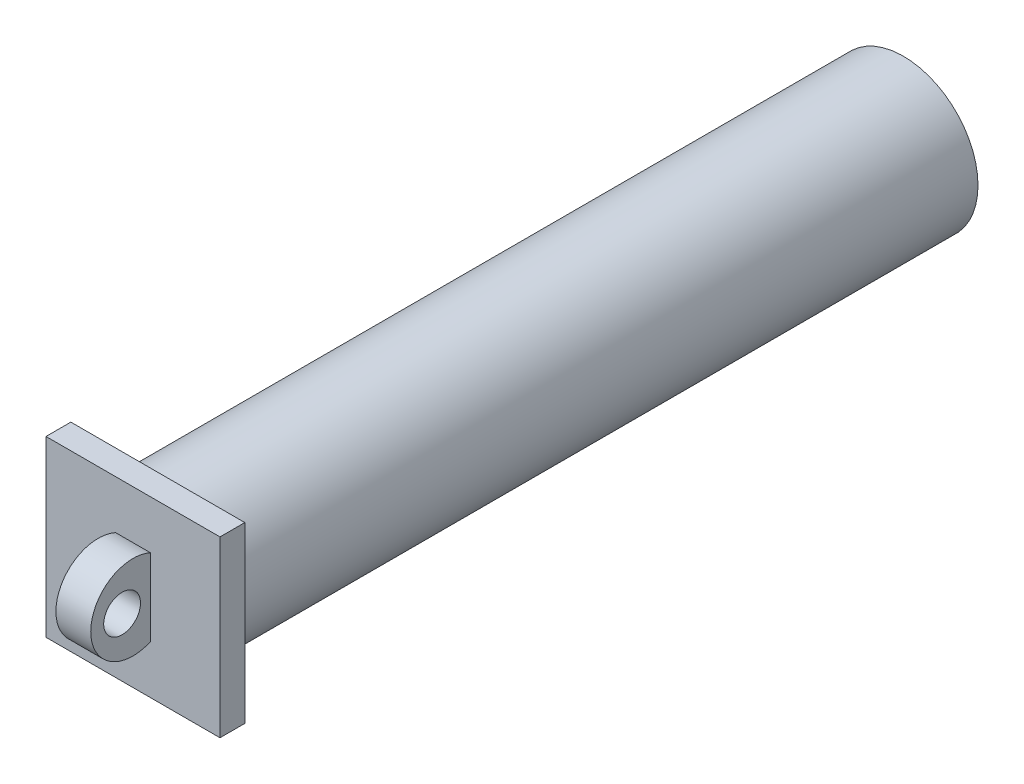
ISO-10303-21;
HEADER;
FILE_DESCRIPTION(('STEP AP214'),'2;1');
FILE_NAME('part.step','',(''),(''),'','','');
FILE_SCHEMA(('AUTOMOTIVE_DESIGN { 1 0 10303 214 1 1 1 1 }'));
ENDSEC;
DATA;
#1=APPLICATION_CONTEXT('core data for automotive mechanical design processes');
#2=APPLICATION_PROTOCOL_DEFINITION('international standard','automotive_design',2000,#1);
#3=PRODUCT_CONTEXT('',#1,'mechanical');
#4=PRODUCT('Part','Part','',(#3));
#5=PRODUCT_RELATED_PRODUCT_CATEGORY('part','',(#4));
#6=PRODUCT_DEFINITION_FORMATION('','',#4);
#7=PRODUCT_DEFINITION_CONTEXT('part definition',#1,'design');
#8=PRODUCT_DEFINITION('design','',#6,#7);
#9=PRODUCT_DEFINITION_SHAPE('','',#8);
#10=(LENGTH_UNIT() NAMED_UNIT(*) SI_UNIT(.MILLI.,.METRE.));
#11=(NAMED_UNIT(*) PLANE_ANGLE_UNIT() SI_UNIT($,.RADIAN.));
#12=(NAMED_UNIT(*) SI_UNIT($,.STERADIAN.) SOLID_ANGLE_UNIT());
#13=UNCERTAINTY_MEASURE_WITH_UNIT(LENGTH_MEASURE(1.E-05),#10,'distance_accuracy_value','');
#14=(GEOMETRIC_REPRESENTATION_CONTEXT(3) GLOBAL_UNCERTAINTY_ASSIGNED_CONTEXT((#13)) GLOBAL_UNIT_ASSIGNED_CONTEXT((#10,
#11,#12)) REPRESENTATION_CONTEXT('',''));
#15=CARTESIAN_POINT('',(0.,0.,0.));
#16=DIRECTION('',(0.,0.,1.));
#17=DIRECTION('',(1.,0.,0.));
#18=AXIS2_PLACEMENT_3D('',#15,#16,#17);
#19=CARTESIAN_POINT('',(-17.5,-17.5,155.));
#20=DIRECTION('',(1.,0.,0.));
#21=DIRECTION('',(0.,0.,-1.));
#22=AXIS2_PLACEMENT_3D('',#19,#20,#21);
#23=PLANE('',#22);
#24=DIRECTION('',(0.,0.,-1.));
#25=VECTOR('',#24,1.);
#26=CARTESIAN_POINT('',(-17.5,-17.5,155.));
#27=LINE('',#26,#25);
#28=CARTESIAN_POINT('',(-17.5,-17.5,155.));
#29=VERTEX_POINT('',#28);
#30=CARTESIAN_POINT('',(-17.5,-17.5,150.));
#31=VERTEX_POINT('',#30);
#32=EDGE_CURVE('E160',#29,#31,#27,.T.);
#33=ORIENTED_EDGE('',*,*,#32,.F.);
#34=DIRECTION('',(0.,-1.,0.));
#35=VECTOR('',#34,1.);
#36=CARTESIAN_POINT('',(-17.5,-17.5,155.));
#37=LINE('',#36,#35);
#38=CARTESIAN_POINT('',(-17.5,17.5,155.));
#39=VERTEX_POINT('',#38);
#40=EDGE_CURVE('E145',#39,#29,#37,.T.);
#41=ORIENTED_EDGE('',*,*,#40,.F.);
#42=DIRECTION('',(0.,0.,-1.));
#43=VECTOR('',#42,1.);
#44=CARTESIAN_POINT('',(-17.5,17.5,155.));
#45=LINE('',#44,#43);
#46=CARTESIAN_POINT('',(-17.5,17.5,150.));
#47=VERTEX_POINT('',#46);
#48=EDGE_CURVE('E163',#39,#47,#45,.T.);
#49=ORIENTED_EDGE('',*,*,#48,.T.);
#50=DIRECTION('',(0.,-1.,0.));
#51=VECTOR('',#50,1.);
#52=CARTESIAN_POINT('',(-17.5,-17.5,150.));
#53=LINE('',#52,#51);
#54=EDGE_CURVE('E153',#47,#31,#53,.T.);
#55=ORIENTED_EDGE('',*,*,#54,.T.);
#56=EDGE_LOOP('',(#33,#41,#49,#55));
#57=FACE_BOUND('',#56,.T.);
#58=ADVANCED_FACE('F47',(#57),#23,.F.);
#59=CARTESIAN_POINT('',(17.5,0.,158.5));
#60=DIRECTION('',(-1.,0.,0.));
#61=DIRECTION('',(0.,0.,1.));
#62=AXIS2_PLACEMENT_3D('',#59,#60,#61);
#63=CYLINDRICAL_SURFACE('',#62,8.50000000000001);
#64=DIRECTION('',(-1.,0.,0.));
#65=VECTOR('',#64,1.);
#66=CARTESIAN_POINT('',(17.5,7.74596669241484,155.));
#67=LINE('',#66,#65);
#68=CARTESIAN_POINT('',(3.5,7.74596669241484,155.));
#69=VERTEX_POINT('',#68);
#70=CARTESIAN_POINT('',(-3.5,7.74596669241484,155.));
#71=VERTEX_POINT('',#70);
#72=EDGE_CURVE('E115',#69,#71,#67,.T.);
#73=ORIENTED_EDGE('',*,*,#72,.T.);
#74=CARTESIAN_POINT('',(-3.5,0.,158.5));
#75=DIRECTION('',(1.,0.,0.));
#76=DIRECTION('',(0.,0.,-1.));
#77=AXIS2_PLACEMENT_3D('',#74,#75,#76);
#78=CIRCLE('',#77,8.50000000000001);
#79=CARTESIAN_POINT('',(-3.5,-7.74596669241484,155.));
#80=VERTEX_POINT('',#79);
#81=EDGE_CURVE('E121',#71,#80,#78,.T.);
#82=ORIENTED_EDGE('',*,*,#81,.T.);
#83=DIRECTION('',(-1.,0.,0.));
#84=VECTOR('',#83,1.);
#85=CARTESIAN_POINT('',(17.5,-7.74596669241484,155.));
#86=LINE('',#85,#84);
#87=CARTESIAN_POINT('',(3.5,-7.74596669241484,155.));
#88=VERTEX_POINT('',#87);
#89=EDGE_CURVE('E117',#88,#80,#86,.T.);
#90=ORIENTED_EDGE('',*,*,#89,.F.);
#91=CARTESIAN_POINT('',(3.5,0.,158.5));
#92=DIRECTION('',(1.,0.,0.));
#93=DIRECTION('',(0.,0.,-1.));
#94=AXIS2_PLACEMENT_3D('',#91,#92,#93);
#95=CIRCLE('',#94,8.50000000000001);
#96=EDGE_CURVE('E128',#69,#88,#95,.T.);
#97=ORIENTED_EDGE('',*,*,#96,.F.);
#98=EDGE_LOOP('',(#73,#82,#90,#97));
#99=FACE_BOUND('',#98,.T.);
#100=ADVANCED_FACE('F127',(#99),#63,.T.);
#101=CARTESIAN_POINT('',(0.,0.,155.));
#102=DIRECTION('',(0.,0.,-1.));
#103=DIRECTION('',(-1.,0.,0.));
#104=AXIS2_PLACEMENT_3D('',#101,#102,#103);
#105=PLANE('',#104);
#106=DIRECTION('',(0.,-1.,0.));
#107=VECTOR('',#106,1.);
#108=CARTESIAN_POINT('',(-3.5,0.,155.));
#109=LINE('',#108,#107);
#110=EDGE_CURVE('E111',#71,#80,#109,.T.);
#111=ORIENTED_EDGE('',*,*,#110,.F.);
#112=ORIENTED_EDGE('',*,*,#72,.F.);
#113=DIRECTION('',(0.,-1.,0.));
#114=VECTOR('',#113,1.);
#115=CARTESIAN_POINT('',(3.5,0.,155.));
#116=LINE('',#115,#114);
#117=EDGE_CURVE('E64',#69,#88,#116,.T.);
#118=ORIENTED_EDGE('',*,*,#117,.T.);
#119=ORIENTED_EDGE('',*,*,#89,.T.);
#120=EDGE_LOOP('',(#111,#112,#118,#119));
#121=FACE_BOUND('',#120,.T.);
#122=ORIENTED_EDGE('',*,*,#40,.T.);
#123=DIRECTION('',(1.,0.,0.));
#124=VECTOR('',#123,1.);
#125=CARTESIAN_POINT('',(-17.5,-17.5,155.));
#126=LINE('',#125,#124);
#127=CARTESIAN_POINT('',(17.5,-17.5,155.));
#128=VERTEX_POINT('',#127);
#129=EDGE_CURVE('E73',#29,#128,#126,.T.);
#130=ORIENTED_EDGE('',*,*,#129,.T.);
#131=DIRECTION('',(0.,1.,0.));
#132=VECTOR('',#131,1.);
#133=CARTESIAN_POINT('',(17.5,-17.5,155.));
#134=LINE('',#133,#132);
#135=CARTESIAN_POINT('',(17.5,17.5,155.));
#136=VERTEX_POINT('',#135);
#137=EDGE_CURVE('E99',#128,#136,#134,.T.);
#138=ORIENTED_EDGE('',*,*,#137,.T.);
#139=DIRECTION('',(-1.,0.,0.));
#140=VECTOR('',#139,1.);
#141=CARTESIAN_POINT('',(-17.5,17.5,155.));
#142=LINE('',#141,#140);
#143=EDGE_CURVE('E142',#136,#39,#142,.T.);
#144=ORIENTED_EDGE('',*,*,#143,.T.);
#145=EDGE_LOOP('',(#122,#130,#138,#144));
#146=FACE_BOUND('',#145,.T.);
#147=ADVANCED_FACE('F113',(#121,#146),#105,.F.);
#148=CARTESIAN_POINT('',(0.,0.,0.));
#149=DIRECTION('',(0.,0.,1.));
#150=DIRECTION('',(1.,0.,0.));
#151=AXIS2_PLACEMENT_3D('',#148,#149,#150);
#152=PLANE('',#151);
#153=CARTESIAN_POINT('',(0.,0.,0.));
#154=DIRECTION('',(0.,0.,1.));
#155=DIRECTION('',(1.,0.,0.));
#156=AXIS2_PLACEMENT_3D('',#153,#154,#155);
#157=CIRCLE('',#156,15.);
#158=CARTESIAN_POINT('',(15.,0.,0.));
#159=VERTEX_POINT('',#158);
#160=EDGE_CURVE('E57',#159,#159,#157,.T.);
#161=ORIENTED_EDGE('',*,*,#160,.F.);
#162=EDGE_LOOP('',(#161));
#163=FACE_BOUND('',#162,.T.);
#164=CARTESIAN_POINT('',(0.,0.,0.));
#165=DIRECTION('',(0.,0.,1.));
#166=DIRECTION('',(1.,0.,0.));
#167=AXIS2_PLACEMENT_3D('',#164,#165,#166);
#168=CIRCLE('',#167,10.);
#169=CARTESIAN_POINT('',(10.,0.,0.));
#170=VERTEX_POINT('',#169);
#171=EDGE_CURVE('E175',#170,#170,#168,.T.);
#172=ORIENTED_EDGE('',*,*,#171,.T.);
#173=EDGE_LOOP('',(#172));
#174=FACE_BOUND('',#173,.T.);
#175=ADVANCED_FACE('F183',(#163,#174),#152,.F.);
#176=CARTESIAN_POINT('',(0.,0.,150.));
#177=DIRECTION('',(0.,0.,-1.));
#178=DIRECTION('',(-1.,0.,0.));
#179=AXIS2_PLACEMENT_3D('',#176,#177,#178);
#180=CYLINDRICAL_SURFACE('',#179,15.);
#181=CARTESIAN_POINT('',(0.,0.,150.));
#182=DIRECTION('',(0.,0.,1.));
#183=DIRECTION('',(1.,0.,0.));
#184=AXIS2_PLACEMENT_3D('',#181,#182,#183);
#185=CIRCLE('',#184,15.);
#186=CARTESIAN_POINT('',(15.,0.,150.));
#187=VERTEX_POINT('',#186);
#188=EDGE_CURVE('E11',#187,#187,#185,.T.);
#189=ORIENTED_EDGE('',*,*,#188,.F.);
#190=EDGE_LOOP('',(#189));
#191=FACE_BOUND('',#190,.T.);
#192=ORIENTED_EDGE('',*,*,#160,.T.);
#193=EDGE_LOOP('',(#192));
#194=FACE_BOUND('',#193,.T.);
#195=ADVANCED_FACE('F49',(#191,#194),#180,.T.);
#196=CARTESIAN_POINT('',(0.,0.,150.));
#197=DIRECTION('',(0.,0.,-1.));
#198=DIRECTION('',(-1.,0.,0.));
#199=AXIS2_PLACEMENT_3D('',#196,#197,#198);
#200=CYLINDRICAL_SURFACE('',#199,10.);
#201=CARTESIAN_POINT('',(0.,0.,150.));
#202=DIRECTION('',(0.,0.,1.));
#203=DIRECTION('',(1.,0.,0.));
#204=AXIS2_PLACEMENT_3D('',#201,#202,#203);
#205=CIRCLE('',#204,10.);
#206=CARTESIAN_POINT('',(10.,0.,150.));
#207=VERTEX_POINT('',#206);
#208=EDGE_CURVE('E171',#207,#207,#205,.T.);
#209=ORIENTED_EDGE('',*,*,#208,.T.);
#210=EDGE_LOOP('',(#209));
#211=FACE_BOUND('',#210,.T.);
#212=ORIENTED_EDGE('',*,*,#171,.F.);
#213=EDGE_LOOP('',(#212));
#214=FACE_BOUND('',#213,.T.);
#215=ADVANCED_FACE('F188',(#211,#214),#200,.F.);
#216=CARTESIAN_POINT('',(0.,0.,150.));
#217=DIRECTION('',(0.,0.,-1.));
#218=DIRECTION('',(-1.,0.,0.));
#219=AXIS2_PLACEMENT_3D('',#216,#217,#218);
#220=PLANE('',#219);
#221=ORIENTED_EDGE('',*,*,#208,.F.);
#222=EDGE_LOOP('',(#221));
#223=FACE_BOUND('',#222,.T.);
#224=ADVANCED_FACE('F190',(#223),#220,.T.);
#225=CARTESIAN_POINT('',(17.5,-17.5,155.));
#226=DIRECTION('',(-1.,0.,0.));
#227=DIRECTION('',(0.,0.,1.));
#228=AXIS2_PLACEMENT_3D('',#225,#226,#227);
#229=PLANE('',#228);
#230=DIRECTION('',(0.,0.,-1.));
#231=VECTOR('',#230,1.);
#232=CARTESIAN_POINT('',(17.5,17.5,155.));
#233=LINE('',#232,#231);
#234=CARTESIAN_POINT('',(17.5,17.5,150.));
#235=VERTEX_POINT('',#234);
#236=EDGE_CURVE('E167',#136,#235,#233,.T.);
#237=ORIENTED_EDGE('',*,*,#236,.F.);
#238=ORIENTED_EDGE('',*,*,#137,.F.);
#239=DIRECTION('',(0.,0.,-1.));
#240=VECTOR('',#239,1.);
#241=CARTESIAN_POINT('',(17.5,-17.5,155.));
#242=LINE('',#241,#240);
#243=CARTESIAN_POINT('',(17.5,-17.5,150.));
#244=VERTEX_POINT('',#243);
#245=EDGE_CURVE('E149',#128,#244,#242,.T.);
#246=ORIENTED_EDGE('',*,*,#245,.T.);
#247=DIRECTION('',(0.,1.,0.));
#248=VECTOR('',#247,1.);
#249=CARTESIAN_POINT('',(17.5,-17.5,150.));
#250=LINE('',#249,#248);
#251=EDGE_CURVE('E130',#244,#235,#250,.T.);
#252=ORIENTED_EDGE('',*,*,#251,.T.);
#253=EDGE_LOOP('',(#237,#238,#246,#252));
#254=FACE_BOUND('',#253,.T.);
#255=ADVANCED_FACE('F197',(#254),#229,.F.);
#256=CARTESIAN_POINT('',(-17.5,17.5,155.));
#257=DIRECTION('',(0.,-1.,0.));
#258=DIRECTION('',(0.,0.,-1.));
#259=AXIS2_PLACEMENT_3D('',#256,#257,#258);
#260=PLANE('',#259);
#261=DIRECTION('',(-1.,0.,0.));
#262=VECTOR('',#261,1.);
#263=CARTESIAN_POINT('',(-17.5,17.5,150.));
#264=LINE('',#263,#262);
#265=EDGE_CURVE('E135',#235,#47,#264,.T.);
#266=ORIENTED_EDGE('',*,*,#265,.T.);
#267=ORIENTED_EDGE('',*,*,#48,.F.);
#268=ORIENTED_EDGE('',*,*,#143,.F.);
#269=ORIENTED_EDGE('',*,*,#236,.T.);
#270=EDGE_LOOP('',(#266,#267,#268,#269));
#271=FACE_BOUND('',#270,.T.);
#272=ADVANCED_FACE('F215',(#271),#260,.F.);
#273=CARTESIAN_POINT('',(-17.5,-17.5,155.));
#274=DIRECTION('',(0.,1.,0.));
#275=DIRECTION('',(0.,0.,1.));
#276=AXIS2_PLACEMENT_3D('',#273,#274,#275);
#277=PLANE('',#276);
#278=DIRECTION('',(1.,0.,0.));
#279=VECTOR('',#278,1.);
#280=CARTESIAN_POINT('',(-17.5,-17.5,150.));
#281=LINE('',#280,#279);
#282=EDGE_CURVE('E94',#31,#244,#281,.T.);
#283=ORIENTED_EDGE('',*,*,#282,.T.);
#284=ORIENTED_EDGE('',*,*,#245,.F.);
#285=ORIENTED_EDGE('',*,*,#129,.F.);
#286=ORIENTED_EDGE('',*,*,#32,.T.);
#287=EDGE_LOOP('',(#283,#284,#285,#286));
#288=FACE_BOUND('',#287,.T.);
#289=ADVANCED_FACE('F214',(#288),#277,.F.);
#290=ORIENTED_EDGE('',*,*,#188,.T.);
#291=EDGE_LOOP('',(#290));
#292=FACE_BOUND('',#291,.T.);
#293=ORIENTED_EDGE('',*,*,#251,.F.);
#294=ORIENTED_EDGE('',*,*,#282,.F.);
#295=ORIENTED_EDGE('',*,*,#54,.F.);
#296=ORIENTED_EDGE('',*,*,#265,.F.);
#297=EDGE_LOOP('',(#293,#294,#295,#296));
#298=FACE_BOUND('',#297,.T.);
#299=ADVANCED_FACE('F200',(#292,#298),#220,.T.);
#300=CARTESIAN_POINT('',(3.5,0.,0.));
#301=DIRECTION('',(1.,0.,0.));
#302=DIRECTION('',(0.,0.,-1.));
#303=AXIS2_PLACEMENT_3D('',#300,#301,#302);
#304=PLANE('',#303);
#305=CARTESIAN_POINT('',(3.5,0.,160.690072365424));
#306=DIRECTION('',(1.,0.,0.));
#307=DIRECTION('',(0.,0.,-1.));
#308=AXIS2_PLACEMENT_3D('',#305,#306,#307);
#309=CIRCLE('',#308,3.70021090057086);
#310=CARTESIAN_POINT('',(3.5,0.,156.989861464854));
#311=VERTEX_POINT('',#310);
#312=EDGE_CURVE('E250',#311,#311,#309,.T.);
#313=ORIENTED_EDGE('',*,*,#312,.F.);
#314=EDGE_LOOP('',(#313));
#315=FACE_BOUND('',#314,.T.);
#316=ORIENTED_EDGE('',*,*,#117,.F.);
#317=ORIENTED_EDGE('',*,*,#96,.T.);
#318=EDGE_LOOP('',(#316,#317));
#319=FACE_BOUND('',#318,.T.);
#320=ADVANCED_FACE('F228',(#315,#319),#304,.T.);
#321=CARTESIAN_POINT('',(-3.5,0.,0.));
#322=DIRECTION('',(1.,0.,0.));
#323=DIRECTION('',(0.,0.,-1.));
#324=AXIS2_PLACEMENT_3D('',#321,#322,#323);
#325=PLANE('',#324);
#326=CARTESIAN_POINT('',(-3.5,0.,160.690072365424));
#327=DIRECTION('',(1.,0.,0.));
#328=DIRECTION('',(0.,0.,-1.));
#329=AXIS2_PLACEMENT_3D('',#326,#327,#328);
#330=CIRCLE('',#329,3.70021090057086);
#331=CARTESIAN_POINT('',(-3.5,0.,156.989861464854));
#332=VERTEX_POINT('',#331);
#333=EDGE_CURVE('E51',#332,#332,#330,.T.);
#334=ORIENTED_EDGE('',*,*,#333,.T.);
#335=EDGE_LOOP('',(#334));
#336=FACE_BOUND('',#335,.T.);
#337=ORIENTED_EDGE('',*,*,#110,.T.);
#338=ORIENTED_EDGE('',*,*,#81,.F.);
#339=EDGE_LOOP('',(#337,#338));
#340=FACE_BOUND('',#339,.T.);
#341=ADVANCED_FACE('F123',(#336,#340),#325,.F.);
#342=CARTESIAN_POINT('',(-17.5,0.,160.690072365424));
#343=DIRECTION('',(1.,0.,0.));
#344=DIRECTION('',(0.,0.,-1.));
#345=AXIS2_PLACEMENT_3D('',#342,#343,#344);
#346=CYLINDRICAL_SURFACE('',#345,3.70021090057086);
#347=CARTESIAN_POINT('',(3.5,0.,156.989861464854));
#348=CARTESIAN_POINT('',(3.42708333333333,0.,156.989861464854));
#349=CARTESIAN_POINT('',(3.35416666666667,0.,156.989861464854));
#350=CARTESIAN_POINT('',(3.20833333333333,0.,156.989861464854));
#351=CARTESIAN_POINT('',(3.13541666666667,0.,156.989861464854));
#352=CARTESIAN_POINT('',(2.98958333333333,0.,156.989861464854));
#353=CARTESIAN_POINT('',(2.91666666666667,0.,156.989861464854));
#354=CARTESIAN_POINT('',(2.77083333333333,0.,156.989861464854));
#355=CARTESIAN_POINT('',(2.69791666666667,0.,156.989861464854));
#356=CARTESIAN_POINT('',(2.55208333333333,0.,156.989861464854));
#357=CARTESIAN_POINT('',(2.47916666666667,0.,156.989861464854));
#358=CARTESIAN_POINT('',(2.33333333333333,0.,156.989861464854));
#359=CARTESIAN_POINT('',(2.26041666666667,0.,156.989861464854));
#360=CARTESIAN_POINT('',(2.11458333333333,0.,156.989861464854));
#361=CARTESIAN_POINT('',(2.04166666666667,0.,156.989861464854));
#362=CARTESIAN_POINT('',(1.89583333333333,0.,156.989861464854));
#363=CARTESIAN_POINT('',(1.82291666666666,0.,156.989861464854));
#364=CARTESIAN_POINT('',(1.67708333333333,0.,156.989861464854));
#365=CARTESIAN_POINT('',(1.60416666666666,0.,156.989861464854));
#366=CARTESIAN_POINT('',(1.45833333333333,0.,156.989861464854));
#367=CARTESIAN_POINT('',(1.38541666666666,0.,156.989861464854));
#368=CARTESIAN_POINT('',(1.23958333333333,0.,156.989861464854));
#369=CARTESIAN_POINT('',(1.16666666666666,0.,156.989861464854));
#370=CARTESIAN_POINT('',(1.02083333333333,0.,156.989861464854));
#371=CARTESIAN_POINT('',(0.947916666666664,0.,156.989861464854));
#372=CARTESIAN_POINT('',(0.802083333333331,0.,156.989861464854));
#373=CARTESIAN_POINT('',(0.729166666666664,0.,156.989861464854));
#374=CARTESIAN_POINT('',(0.58333333333333,0.,156.989861464854));
#375=CARTESIAN_POINT('',(0.510416666666664,0.,156.989861464854));
#376=CARTESIAN_POINT('',(0.364583333333331,0.,156.989861464854));
#377=CARTESIAN_POINT('',(0.291666666666666,0.,156.989861464854));
#378=CARTESIAN_POINT('',(0.145833333333332,0.,156.989861464854));
#379=CARTESIAN_POINT('',(0.0729166666666644,0.,156.989861464854));
#380=CARTESIAN_POINT('',(-0.072916666666669,0.,156.989861464854));
#381=CARTESIAN_POINT('',(-0.145833333333335,0.,156.989861464854));
#382=CARTESIAN_POINT('',(-0.291666666666668,0.,156.989861464854));
#383=CARTESIAN_POINT('',(-0.364583333333336,0.,156.989861464854));
#384=CARTESIAN_POINT('',(-0.510416666666669,0.,156.989861464854));
#385=CARTESIAN_POINT('',(-0.583333333333335,0.,156.989861464854));
#386=CARTESIAN_POINT('',(-0.729166666666668,0.,156.989861464854));
#387=CARTESIAN_POINT('',(-0.802083333333336,0.,156.989861464854));
#388=CARTESIAN_POINT('',(-0.94791666666667,0.,156.989861464854));
#389=CARTESIAN_POINT('',(-1.02083333333334,0.,156.989861464854));
#390=CARTESIAN_POINT('',(-1.16666666666667,0.,156.989861464854));
#391=CARTESIAN_POINT('',(-1.23958333333333,0.,156.989861464854));
#392=CARTESIAN_POINT('',(-1.38541666666667,0.,156.989861464854));
#393=CARTESIAN_POINT('',(-1.45833333333333,0.,156.989861464854));
#394=CARTESIAN_POINT('',(-1.60416666666667,0.,156.989861464854));
#395=CARTESIAN_POINT('',(-1.67708333333333,0.,156.989861464854));
#396=CARTESIAN_POINT('',(-1.82291666666667,0.,156.989861464854));
#397=CARTESIAN_POINT('',(-1.89583333333333,0.,156.989861464854));
#398=CARTESIAN_POINT('',(-2.04166666666667,0.,156.989861464854));
#399=CARTESIAN_POINT('',(-2.11458333333333,0.,156.989861464854));
#400=CARTESIAN_POINT('',(-2.26041666666667,0.,156.989861464854));
#401=CARTESIAN_POINT('',(-2.33333333333333,0.,156.989861464854));
#402=CARTESIAN_POINT('',(-2.47916666666667,0.,156.989861464854));
#403=CARTESIAN_POINT('',(-2.55208333333333,0.,156.989861464854));
#404=CARTESIAN_POINT('',(-2.69791666666667,0.,156.989861464854));
#405=CARTESIAN_POINT('',(-2.77083333333333,0.,156.989861464854));
#406=CARTESIAN_POINT('',(-2.91666666666667,0.,156.989861464854));
#407=CARTESIAN_POINT('',(-2.98958333333333,0.,156.989861464854));
#408=CARTESIAN_POINT('',(-3.13541666666667,0.,156.989861464854));
#409=CARTESIAN_POINT('',(-3.20833333333333,0.,156.989861464854));
#410=CARTESIAN_POINT('',(-3.35416666666667,0.,156.989861464854));
#411=CARTESIAN_POINT('',(-3.42708333333333,0.,156.989861464854));
#412=CARTESIAN_POINT('',(-3.5,0.,156.989861464854));
#413=B_SPLINE_CURVE_WITH_KNOTS('',3,(#347,#348,#349,#350,#351,#352,#353,#354,#355,#356,#357,
#358,#359,#360,#361,#362,#363,#364,#365,#366,#367,#368,#369,#370,#371,#372,#373,#374,#375,#376,
#377,#378,#379,#380,#381,#382,#383,#384,#385,#386,#387,#388,#389,#390,#391,#392,#393,#394,#395,
#396,#397,#398,#399,#400,#401,#402,#403,#404,#405,#406,#407,#408,#409,#410,#411,#412),
.UNSPECIFIED.,.F.,.F.,(4,2,2,2,2,2,2,2,2,2,2,2,2,2,2,2,2,2,2,2,2,2,2,2,2,2,2,2,2,2,2,2,4),(0.,
0.21875,0.4375,0.656250000000001,0.875000000000001,1.09375,1.3125,1.53125,1.75,1.96875,2.1875,
2.40625,2.625,2.84375,3.0625,3.28125,3.5,3.71875,3.9375,4.15625,4.375,4.59375,4.8125,5.03125,
5.25,5.46875,5.6875,5.90625,6.125,6.34375,6.5625,6.78125,7.),.UNSPECIFIED.);
#414=EDGE_CURVE('BSEAM241',#311,#332,#413,.T.);
#415=ORIENTED_EDGE('',*,*,#312,.T.);
#416=ORIENTED_EDGE('',*,*,#333,.F.);
#417=ORIENTED_EDGE('',*,*,#414,.T.);
#418=ORIENTED_EDGE('',*,*,#414,.F.);
#419=EDGE_LOOP('',(#415,#417,#416,#418));
#420=FACE_BOUND('',#419,.T.);
#421=ADVANCED_FACE('F241',(#420),#346,.F.);
#422=CLOSED_SHELL('',(#58,#100,#147,#175,#195,#215,#224,#255,#272,#289,#299,#320,#341,#421));
#423=MANIFOLD_SOLID_BREP('B2',#422);
#424=ADVANCED_BREP_SHAPE_REPRESENTATION('',(#18,#423),#14);
#425=SHAPE_DEFINITION_REPRESENTATION(#9,#424);
ENDSEC;
END-ISO-10303-21;
